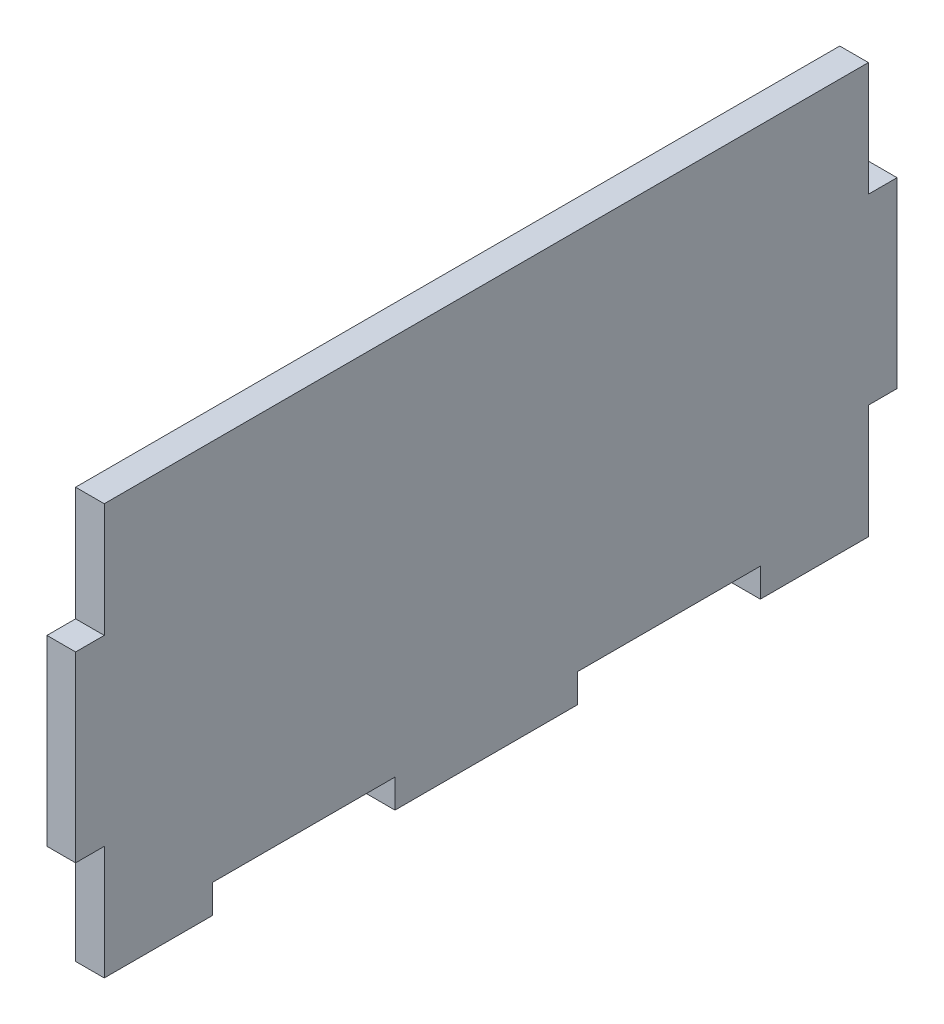
ISO-10303-21;
HEADER;
FILE_DESCRIPTION(('STEP AP214'),'2;1');
FILE_NAME('part.step','',(''),(''),'','','');
FILE_SCHEMA(('AUTOMOTIVE_DESIGN { 1 0 10303 214 1 1 1 1 }'));
ENDSEC;
DATA;
#1=APPLICATION_CONTEXT('core data for automotive mechanical design processes');
#2=APPLICATION_PROTOCOL_DEFINITION('international standard','automotive_design',2000,#1);
#3=PRODUCT_CONTEXT('',#1,'mechanical');
#4=PRODUCT('Part','Part','',(#3));
#5=PRODUCT_RELATED_PRODUCT_CATEGORY('part','',(#4));
#6=PRODUCT_DEFINITION_FORMATION('','',#4);
#7=PRODUCT_DEFINITION_CONTEXT('part definition',#1,'design');
#8=PRODUCT_DEFINITION('design','',#6,#7);
#9=PRODUCT_DEFINITION_SHAPE('','',#8);
#10=(LENGTH_UNIT() NAMED_UNIT(*) SI_UNIT(.MILLI.,.METRE.));
#11=(NAMED_UNIT(*) PLANE_ANGLE_UNIT() SI_UNIT($,.RADIAN.));
#12=(NAMED_UNIT(*) SI_UNIT($,.STERADIAN.) SOLID_ANGLE_UNIT());
#13=UNCERTAINTY_MEASURE_WITH_UNIT(LENGTH_MEASURE(1.E-05),#10,'distance_accuracy_value','');
#14=(GEOMETRIC_REPRESENTATION_CONTEXT(3) GLOBAL_UNCERTAINTY_ASSIGNED_CONTEXT((#13)) GLOBAL_UNIT_ASSIGNED_CONTEXT((#10,
#11,#12)) REPRESENTATION_CONTEXT('',''));
#15=CARTESIAN_POINT('',(0.,0.,0.));
#16=DIRECTION('',(0.,0.,1.));
#17=DIRECTION('',(1.,0.,0.));
#18=AXIS2_PLACEMENT_3D('',#15,#16,#17);
#19=CARTESIAN_POINT('',(3.,-27.22111753652,-97.3189618076706));
#20=DIRECTION('',(0.,-1.,0.));
#21=DIRECTION('',(0.,0.,-1.));
#22=AXIS2_PLACEMENT_3D('',#19,#20,#21);
#23=PLANE('',#22);
#24=DIRECTION('',(0.,0.,1.));
#25=VECTOR('',#24,1.);
#26=CARTESIAN_POINT('',(0.,-27.22111753652,-97.3189618076706));
#27=LINE('',#26,#25);
#28=CARTESIAN_POINT('',(0.,-27.22111753652,-97.3189618076706));
#29=VERTEX_POINT('',#28);
#30=CARTESIAN_POINT('',(0.,-27.22111753652,-17.3189618076706));
#31=VERTEX_POINT('',#30);
#32=EDGE_CURVE('E212',#29,#31,#27,.T.);
#33=ORIENTED_EDGE('',*,*,#32,.T.);
#34=DIRECTION('',(-1.,0.,0.));
#35=VECTOR('',#34,1.);
#36=CARTESIAN_POINT('',(3.,-27.22111753652,-17.3189618076706));
#37=LINE('',#36,#35);
#38=CARTESIAN_POINT('',(3.,-27.22111753652,-17.3189618076706));
#39=VERTEX_POINT('',#38);
#40=EDGE_CURVE('E11',#39,#31,#37,.T.);
#41=ORIENTED_EDGE('',*,*,#40,.F.);
#42=DIRECTION('',(0.,0.,1.));
#43=VECTOR('',#42,1.);
#44=CARTESIAN_POINT('',(3.,-27.22111753652,-97.3189618076706));
#45=LINE('',#44,#43);
#46=CARTESIAN_POINT('',(3.,-27.22111753652,-97.3189618076706));
#47=VERTEX_POINT('',#46);
#48=EDGE_CURVE('E270',#47,#39,#45,.T.);
#49=ORIENTED_EDGE('',*,*,#48,.F.);
#50=DIRECTION('',(-1.,0.,0.));
#51=VECTOR('',#50,1.);
#52=CARTESIAN_POINT('',(3.,-27.22111753652,-97.3189618076706));
#53=LINE('',#52,#51);
#54=EDGE_CURVE('E208',#47,#29,#53,.T.);
#55=ORIENTED_EDGE('',*,*,#54,.T.);
#56=EDGE_LOOP('',(#33,#41,#49,#55));
#57=FACE_BOUND('',#56,.T.);
#58=ADVANCED_FACE('F39',(#57),#23,.F.);
#59=CARTESIAN_POINT('',(3.,-27.22111753652,-17.3189618076706));
#60=DIRECTION('',(0.,0.,-1.));
#61=DIRECTION('',(-1.,0.,0.));
#62=AXIS2_PLACEMENT_3D('',#59,#60,#61);
#63=PLANE('',#62);
#64=DIRECTION('',(0.,-1.,0.));
#65=VECTOR('',#64,1.);
#66=CARTESIAN_POINT('',(0.,-27.22111753652,-17.3189618076706));
#67=LINE('',#66,#65);
#68=CARTESIAN_POINT('',(0.,-39.15861753652,-17.3189618076706));
#69=VERTEX_POINT('',#68);
#70=EDGE_CURVE('E216',#31,#69,#67,.T.);
#71=ORIENTED_EDGE('',*,*,#70,.T.);
#72=DIRECTION('',(-1.,0.,0.));
#73=VECTOR('',#72,1.);
#74=CARTESIAN_POINT('',(3.,-39.15861753652,-17.3189618076706));
#75=LINE('',#74,#73);
#76=CARTESIAN_POINT('',(3.,-39.15861753652,-17.3189618076706));
#77=VERTEX_POINT('',#76);
#78=EDGE_CURVE('E48',#77,#69,#75,.T.);
#79=ORIENTED_EDGE('',*,*,#78,.F.);
#80=DIRECTION('',(0.,-1.,0.));
#81=VECTOR('',#80,1.);
#82=CARTESIAN_POINT('',(3.,-27.22111753652,-17.3189618076706));
#83=LINE('',#82,#81);
#84=EDGE_CURVE('E135',#39,#77,#83,.T.);
#85=ORIENTED_EDGE('',*,*,#84,.F.);
#86=ORIENTED_EDGE('',*,*,#40,.T.);
#87=EDGE_LOOP('',(#71,#79,#85,#86));
#88=FACE_BOUND('',#87,.T.);
#89=ADVANCED_FACE('F420',(#88),#63,.F.);
#90=CARTESIAN_POINT('',(3.,-39.15861753652,-17.3189618076706));
#91=DIRECTION('',(0.,-1.,0.));
#92=DIRECTION('',(0.,0.,-1.));
#93=AXIS2_PLACEMENT_3D('',#90,#91,#92);
#94=PLANE('',#93);
#95=DIRECTION('',(0.,0.,1.));
#96=VECTOR('',#95,1.);
#97=CARTESIAN_POINT('',(0.,-39.15861753652,-17.3189618076706));
#98=LINE('',#97,#96);
#99=CARTESIAN_POINT('',(0.,-39.15861753652,-14.3189618076706));
#100=VERTEX_POINT('',#99);
#101=EDGE_CURVE('E219',#69,#100,#98,.T.);
#102=ORIENTED_EDGE('',*,*,#101,.T.);
#103=DIRECTION('',(-1.,0.,0.));
#104=VECTOR('',#103,1.);
#105=CARTESIAN_POINT('',(3.,-39.15861753652,-14.3189618076706));
#106=LINE('',#105,#104);
#107=CARTESIAN_POINT('',(3.,-39.15861753652,-14.3189618076706));
#108=VERTEX_POINT('',#107);
#109=EDGE_CURVE('E329',#108,#100,#106,.T.);
#110=ORIENTED_EDGE('',*,*,#109,.F.);
#111=DIRECTION('',(0.,0.,1.));
#112=VECTOR('',#111,1.);
#113=CARTESIAN_POINT('',(3.,-39.15861753652,-17.3189618076706));
#114=LINE('',#113,#112);
#115=EDGE_CURVE('E339',#77,#108,#114,.T.);
#116=ORIENTED_EDGE('',*,*,#115,.F.);
#117=ORIENTED_EDGE('',*,*,#78,.T.);
#118=EDGE_LOOP('',(#102,#110,#116,#117));
#119=FACE_BOUND('',#118,.T.);
#120=ADVANCED_FACE('F337',(#119),#94,.F.);
#121=CARTESIAN_POINT('',(3.,-39.15861753652,-14.3189618076706));
#122=DIRECTION('',(0.,0.,-1.));
#123=DIRECTION('',(-1.,0.,0.));
#124=AXIS2_PLACEMENT_3D('',#121,#122,#123);
#125=PLANE('',#124);
#126=DIRECTION('',(0.,-1.,0.));
#127=VECTOR('',#126,1.);
#128=CARTESIAN_POINT('',(0.,-39.15861753652,-14.3189618076706));
#129=LINE('',#128,#127);
#130=CARTESIAN_POINT('',(0.,-58.28361753652,-14.3189618076706));
#131=VERTEX_POINT('',#130);
#132=EDGE_CURVE('E222',#100,#131,#129,.T.);
#133=ORIENTED_EDGE('',*,*,#132,.T.);
#134=DIRECTION('',(-1.,0.,0.));
#135=VECTOR('',#134,1.);
#136=CARTESIAN_POINT('',(3.,-58.28361753652,-14.3189618076706));
#137=LINE('',#136,#135);
#138=CARTESIAN_POINT('',(3.,-58.28361753652,-14.3189618076706));
#139=VERTEX_POINT('',#138);
#140=EDGE_CURVE('E325',#139,#131,#137,.T.);
#141=ORIENTED_EDGE('',*,*,#140,.F.);
#142=DIRECTION('',(0.,-1.,0.));
#143=VECTOR('',#142,1.);
#144=CARTESIAN_POINT('',(3.,-39.15861753652,-14.3189618076706));
#145=LINE('',#144,#143);
#146=EDGE_CURVE('E358',#108,#139,#145,.T.);
#147=ORIENTED_EDGE('',*,*,#146,.F.);
#148=ORIENTED_EDGE('',*,*,#109,.T.);
#149=EDGE_LOOP('',(#133,#141,#147,#148));
#150=FACE_BOUND('',#149,.T.);
#151=ADVANCED_FACE('F348',(#150),#125,.F.);
#152=CARTESIAN_POINT('',(3.,-58.28361753652,-14.3189618076706));
#153=DIRECTION('',(0.,1.,0.));
#154=DIRECTION('',(0.,0.,1.));
#155=AXIS2_PLACEMENT_3D('',#152,#153,#154);
#156=PLANE('',#155);
#157=DIRECTION('',(0.,0.,-1.));
#158=VECTOR('',#157,1.);
#159=CARTESIAN_POINT('',(0.,-58.28361753652,-14.3189618076706));
#160=LINE('',#159,#158);
#161=CARTESIAN_POINT('',(0.,-58.28361753652,-17.3189618076706));
#162=VERTEX_POINT('',#161);
#163=EDGE_CURVE('E225',#131,#162,#160,.T.);
#164=ORIENTED_EDGE('',*,*,#163,.T.);
#165=DIRECTION('',(-1.,0.,0.));
#166=VECTOR('',#165,1.);
#167=CARTESIAN_POINT('',(3.,-58.28361753652,-17.3189618076706));
#168=LINE('',#167,#166);
#169=CARTESIAN_POINT('',(3.,-58.28361753652,-17.3189618076706));
#170=VERTEX_POINT('',#169);
#171=EDGE_CURVE('E321',#170,#162,#168,.T.);
#172=ORIENTED_EDGE('',*,*,#171,.F.);
#173=DIRECTION('',(0.,0.,-1.));
#174=VECTOR('',#173,1.);
#175=CARTESIAN_POINT('',(3.,-58.28361753652,-14.3189618076706));
#176=LINE('',#175,#174);
#177=EDGE_CURVE('E354',#139,#170,#176,.T.);
#178=ORIENTED_EDGE('',*,*,#177,.F.);
#179=ORIENTED_EDGE('',*,*,#140,.T.);
#180=EDGE_LOOP('',(#164,#172,#178,#179));
#181=FACE_BOUND('',#180,.T.);
#182=ADVANCED_FACE('F352',(#181),#156,.F.);
#183=CARTESIAN_POINT('',(3.,-58.28361753652,-17.3189618076706));
#184=DIRECTION('',(0.,0.,-1.));
#185=DIRECTION('',(-1.,0.,0.));
#186=AXIS2_PLACEMENT_3D('',#183,#184,#185);
#187=PLANE('',#186);
#188=DIRECTION('',(0.,-1.,0.));
#189=VECTOR('',#188,1.);
#190=CARTESIAN_POINT('',(0.,-58.28361753652,-17.3189618076706));
#191=LINE('',#190,#189);
#192=CARTESIAN_POINT('',(0.,-70.22111753652,-17.3189618076706));
#193=VERTEX_POINT('',#192);
#194=EDGE_CURVE('E228',#162,#193,#191,.T.);
#195=ORIENTED_EDGE('',*,*,#194,.T.);
#196=DIRECTION('',(-1.,0.,0.));
#197=VECTOR('',#196,1.);
#198=CARTESIAN_POINT('',(3.,-70.22111753652,-17.3189618076706));
#199=LINE('',#198,#197);
#200=CARTESIAN_POINT('',(3.,-70.22111753652,-17.3189618076706));
#201=VERTEX_POINT('',#200);
#202=EDGE_CURVE('E317',#201,#193,#199,.T.);
#203=ORIENTED_EDGE('',*,*,#202,.F.);
#204=DIRECTION('',(0.,-1.,0.));
#205=VECTOR('',#204,1.);
#206=CARTESIAN_POINT('',(3.,-58.28361753652,-17.3189618076706));
#207=LINE('',#206,#205);
#208=EDGE_CURVE('E357',#170,#201,#207,.T.);
#209=ORIENTED_EDGE('',*,*,#208,.F.);
#210=ORIENTED_EDGE('',*,*,#171,.T.);
#211=EDGE_LOOP('',(#195,#203,#209,#210));
#212=FACE_BOUND('',#211,.T.);
#213=ADVANCED_FACE('F433',(#212),#187,.F.);
#214=CARTESIAN_POINT('',(3.,-70.22111753652,-17.3189618076706));
#215=DIRECTION('',(0.,1.,0.));
#216=DIRECTION('',(0.,0.,1.));
#217=AXIS2_PLACEMENT_3D('',#214,#215,#216);
#218=PLANE('',#217);
#219=DIRECTION('',(0.,0.,-1.));
#220=VECTOR('',#219,1.);
#221=CARTESIAN_POINT('',(0.,-70.22111753652,-17.3189618076706));
#222=LINE('',#221,#220);
#223=CARTESIAN_POINT('',(0.,-70.22111753652,-28.6314618076706));
#224=VERTEX_POINT('',#223);
#225=EDGE_CURVE('E231',#193,#224,#222,.T.);
#226=ORIENTED_EDGE('',*,*,#225,.T.);
#227=DIRECTION('',(-1.,0.,0.));
#228=VECTOR('',#227,1.);
#229=CARTESIAN_POINT('',(3.,-70.22111753652,-28.6314618076706));
#230=LINE('',#229,#228);
#231=CARTESIAN_POINT('',(3.,-70.22111753652,-28.6314618076706));
#232=VERTEX_POINT('',#231);
#233=EDGE_CURVE('E313',#232,#224,#230,.T.);
#234=ORIENTED_EDGE('',*,*,#233,.F.);
#235=DIRECTION('',(0.,0.,-1.));
#236=VECTOR('',#235,1.);
#237=CARTESIAN_POINT('',(3.,-70.22111753652,-17.3189618076706));
#238=LINE('',#237,#236);
#239=EDGE_CURVE('E362',#201,#232,#238,.T.);
#240=ORIENTED_EDGE('',*,*,#239,.F.);
#241=ORIENTED_EDGE('',*,*,#202,.T.);
#242=EDGE_LOOP('',(#226,#234,#240,#241));
#243=FACE_BOUND('',#242,.T.);
#244=ADVANCED_FACE('F436',(#243),#218,.F.);
#245=CARTESIAN_POINT('',(3.,-70.22111753652,-28.6314618076706));
#246=DIRECTION('',(0.,0.,1.));
#247=DIRECTION('',(1.,0.,0.));
#248=AXIS2_PLACEMENT_3D('',#245,#246,#247);
#249=PLANE('',#248);
#250=DIRECTION('',(0.,1.,0.));
#251=VECTOR('',#250,1.);
#252=CARTESIAN_POINT('',(0.,-70.22111753652,-28.6314618076706));
#253=LINE('',#252,#251);
#254=CARTESIAN_POINT('',(0.,-67.22111753652,-28.6314618076706));
#255=VERTEX_POINT('',#254);
#256=EDGE_CURVE('E234',#224,#255,#253,.T.);
#257=ORIENTED_EDGE('',*,*,#256,.T.);
#258=DIRECTION('',(-1.,0.,0.));
#259=VECTOR('',#258,1.);
#260=CARTESIAN_POINT('',(3.,-67.22111753652,-28.6314618076706));
#261=LINE('',#260,#259);
#262=CARTESIAN_POINT('',(3.,-67.22111753652,-28.6314618076706));
#263=VERTEX_POINT('',#262);
#264=EDGE_CURVE('E309',#263,#255,#261,.T.);
#265=ORIENTED_EDGE('',*,*,#264,.F.);
#266=DIRECTION('',(0.,1.,0.));
#267=VECTOR('',#266,1.);
#268=CARTESIAN_POINT('',(3.,-70.22111753652,-28.6314618076706));
#269=LINE('',#268,#267);
#270=EDGE_CURVE('E369',#232,#263,#269,.T.);
#271=ORIENTED_EDGE('',*,*,#270,.F.);
#272=ORIENTED_EDGE('',*,*,#233,.T.);
#273=EDGE_LOOP('',(#257,#265,#271,#272));
#274=FACE_BOUND('',#273,.T.);
#275=ADVANCED_FACE('F440',(#274),#249,.F.);
#276=CARTESIAN_POINT('',(3.,-67.22111753652,-28.6314618076706));
#277=DIRECTION('',(0.,1.,0.));
#278=DIRECTION('',(0.,0.,1.));
#279=AXIS2_PLACEMENT_3D('',#276,#277,#278);
#280=PLANE('',#279);
#281=DIRECTION('',(0.,0.,-1.));
#282=VECTOR('',#281,1.);
#283=CARTESIAN_POINT('',(0.,-67.22111753652,-28.6314618076706));
#284=LINE('',#283,#282);
#285=CARTESIAN_POINT('',(0.,-67.22111753652,-47.7564618076706));
#286=VERTEX_POINT('',#285);
#287=EDGE_CURVE('E237',#255,#286,#284,.T.);
#288=ORIENTED_EDGE('',*,*,#287,.T.);
#289=DIRECTION('',(-1.,0.,0.));
#290=VECTOR('',#289,1.);
#291=CARTESIAN_POINT('',(3.,-67.22111753652,-47.7564618076706));
#292=LINE('',#291,#290);
#293=CARTESIAN_POINT('',(3.,-67.22111753652,-47.7564618076706));
#294=VERTEX_POINT('',#293);
#295=EDGE_CURVE('E305',#294,#286,#292,.T.);
#296=ORIENTED_EDGE('',*,*,#295,.F.);
#297=DIRECTION('',(0.,0.,-1.));
#298=VECTOR('',#297,1.);
#299=CARTESIAN_POINT('',(3.,-67.22111753652,-28.6314618076706));
#300=LINE('',#299,#298);
#301=EDGE_CURVE('E372',#263,#294,#300,.T.);
#302=ORIENTED_EDGE('',*,*,#301,.F.);
#303=ORIENTED_EDGE('',*,*,#264,.T.);
#304=EDGE_LOOP('',(#288,#296,#302,#303));
#305=FACE_BOUND('',#304,.T.);
#306=ADVANCED_FACE('F444',(#305),#280,.F.);
#307=CARTESIAN_POINT('',(3.,-67.22111753652,-47.7564618076706));
#308=DIRECTION('',(0.,0.,-1.));
#309=DIRECTION('',(-1.,0.,0.));
#310=AXIS2_PLACEMENT_3D('',#307,#308,#309);
#311=PLANE('',#310);
#312=DIRECTION('',(0.,-1.,0.));
#313=VECTOR('',#312,1.);
#314=CARTESIAN_POINT('',(0.,-67.22111753652,-47.7564618076706));
#315=LINE('',#314,#313);
#316=CARTESIAN_POINT('',(0.,-70.22111753652,-47.7564618076706));
#317=VERTEX_POINT('',#316);
#318=EDGE_CURVE('E240',#286,#317,#315,.T.);
#319=ORIENTED_EDGE('',*,*,#318,.T.);
#320=DIRECTION('',(-1.,0.,0.));
#321=VECTOR('',#320,1.);
#322=CARTESIAN_POINT('',(3.,-70.22111753652,-47.7564618076706));
#323=LINE('',#322,#321);
#324=CARTESIAN_POINT('',(3.,-70.22111753652,-47.7564618076706));
#325=VERTEX_POINT('',#324);
#326=EDGE_CURVE('E301',#325,#317,#323,.T.);
#327=ORIENTED_EDGE('',*,*,#326,.F.);
#328=DIRECTION('',(0.,-1.,0.));
#329=VECTOR('',#328,1.);
#330=CARTESIAN_POINT('',(3.,-67.22111753652,-47.7564618076706));
#331=LINE('',#330,#329);
#332=EDGE_CURVE('E375',#294,#325,#331,.T.);
#333=ORIENTED_EDGE('',*,*,#332,.F.);
#334=ORIENTED_EDGE('',*,*,#295,.T.);
#335=EDGE_LOOP('',(#319,#327,#333,#334));
#336=FACE_BOUND('',#335,.T.);
#337=ADVANCED_FACE('F448',(#336),#311,.F.);
#338=CARTESIAN_POINT('',(3.,-70.22111753652,-47.7564618076706));
#339=DIRECTION('',(0.,1.,0.));
#340=DIRECTION('',(0.,0.,1.));
#341=AXIS2_PLACEMENT_3D('',#338,#339,#340);
#342=PLANE('',#341);
#343=DIRECTION('',(0.,0.,-1.));
#344=VECTOR('',#343,1.);
#345=CARTESIAN_POINT('',(0.,-70.22111753652,-47.7564618076706));
#346=LINE('',#345,#344);
#347=CARTESIAN_POINT('',(0.,-70.22111753652,-66.8814618076706));
#348=VERTEX_POINT('',#347);
#349=EDGE_CURVE('E243',#317,#348,#346,.T.);
#350=ORIENTED_EDGE('',*,*,#349,.T.);
#351=DIRECTION('',(-1.,0.,0.));
#352=VECTOR('',#351,1.);
#353=CARTESIAN_POINT('',(3.,-70.22111753652,-66.8814618076706));
#354=LINE('',#353,#352);
#355=CARTESIAN_POINT('',(3.,-70.22111753652,-66.8814618076706));
#356=VERTEX_POINT('',#355);
#357=EDGE_CURVE('E297',#356,#348,#354,.T.);
#358=ORIENTED_EDGE('',*,*,#357,.F.);
#359=DIRECTION('',(0.,0.,-1.));
#360=VECTOR('',#359,1.);
#361=CARTESIAN_POINT('',(3.,-70.22111753652,-47.7564618076706));
#362=LINE('',#361,#360);
#363=EDGE_CURVE('E378',#325,#356,#362,.T.);
#364=ORIENTED_EDGE('',*,*,#363,.F.);
#365=ORIENTED_EDGE('',*,*,#326,.T.);
#366=EDGE_LOOP('',(#350,#358,#364,#365));
#367=FACE_BOUND('',#366,.T.);
#368=ADVANCED_FACE('F452',(#367),#342,.F.);
#369=CARTESIAN_POINT('',(3.,-70.22111753652,-66.8814618076706));
#370=DIRECTION('',(0.,0.,1.));
#371=DIRECTION('',(1.,0.,0.));
#372=AXIS2_PLACEMENT_3D('',#369,#370,#371);
#373=PLANE('',#372);
#374=DIRECTION('',(0.,1.,0.));
#375=VECTOR('',#374,1.);
#376=CARTESIAN_POINT('',(0.,-70.22111753652,-66.8814618076706));
#377=LINE('',#376,#375);
#378=CARTESIAN_POINT('',(0.,-67.22111753652,-66.8814618076706));
#379=VERTEX_POINT('',#378);
#380=EDGE_CURVE('E246',#348,#379,#377,.T.);
#381=ORIENTED_EDGE('',*,*,#380,.T.);
#382=DIRECTION('',(-1.,0.,0.));
#383=VECTOR('',#382,1.);
#384=CARTESIAN_POINT('',(3.,-67.22111753652,-66.8814618076706));
#385=LINE('',#384,#383);
#386=CARTESIAN_POINT('',(3.,-67.22111753652,-66.8814618076706));
#387=VERTEX_POINT('',#386);
#388=EDGE_CURVE('E293',#387,#379,#385,.T.);
#389=ORIENTED_EDGE('',*,*,#388,.F.);
#390=DIRECTION('',(0.,1.,0.));
#391=VECTOR('',#390,1.);
#392=CARTESIAN_POINT('',(3.,-70.22111753652,-66.8814618076706));
#393=LINE('',#392,#391);
#394=EDGE_CURVE('E381',#356,#387,#393,.T.);
#395=ORIENTED_EDGE('',*,*,#394,.F.);
#396=ORIENTED_EDGE('',*,*,#357,.T.);
#397=EDGE_LOOP('',(#381,#389,#395,#396));
#398=FACE_BOUND('',#397,.T.);
#399=ADVANCED_FACE('F456',(#398),#373,.F.);
#400=CARTESIAN_POINT('',(3.,-67.22111753652,-66.8814618076706));
#401=DIRECTION('',(0.,1.,0.));
#402=DIRECTION('',(0.,0.,1.));
#403=AXIS2_PLACEMENT_3D('',#400,#401,#402);
#404=PLANE('',#403);
#405=DIRECTION('',(0.,0.,-1.));
#406=VECTOR('',#405,1.);
#407=CARTESIAN_POINT('',(0.,-67.22111753652,-66.8814618076706));
#408=LINE('',#407,#406);
#409=CARTESIAN_POINT('',(0.,-67.22111753652,-86.0064618076706));
#410=VERTEX_POINT('',#409);
#411=EDGE_CURVE('E249',#379,#410,#408,.T.);
#412=ORIENTED_EDGE('',*,*,#411,.T.);
#413=DIRECTION('',(-1.,0.,0.));
#414=VECTOR('',#413,1.);
#415=CARTESIAN_POINT('',(3.,-67.22111753652,-86.0064618076706));
#416=LINE('',#415,#414);
#417=CARTESIAN_POINT('',(3.,-67.22111753652,-86.0064618076706));
#418=VERTEX_POINT('',#417);
#419=EDGE_CURVE('E289',#418,#410,#416,.T.);
#420=ORIENTED_EDGE('',*,*,#419,.F.);
#421=DIRECTION('',(0.,0.,-1.));
#422=VECTOR('',#421,1.);
#423=CARTESIAN_POINT('',(3.,-67.22111753652,-66.8814618076706));
#424=LINE('',#423,#422);
#425=EDGE_CURVE('E384',#387,#418,#424,.T.);
#426=ORIENTED_EDGE('',*,*,#425,.F.);
#427=ORIENTED_EDGE('',*,*,#388,.T.);
#428=EDGE_LOOP('',(#412,#420,#426,#427));
#429=FACE_BOUND('',#428,.T.);
#430=ADVANCED_FACE('F460',(#429),#404,.F.);
#431=CARTESIAN_POINT('',(3.,-67.22111753652,-86.0064618076706));
#432=DIRECTION('',(0.,0.,-1.));
#433=DIRECTION('',(-1.,0.,0.));
#434=AXIS2_PLACEMENT_3D('',#431,#432,#433);
#435=PLANE('',#434);
#436=DIRECTION('',(0.,-1.,0.));
#437=VECTOR('',#436,1.);
#438=CARTESIAN_POINT('',(0.,-67.22111753652,-86.0064618076706));
#439=LINE('',#438,#437);
#440=CARTESIAN_POINT('',(0.,-70.22111753652,-86.0064618076706));
#441=VERTEX_POINT('',#440);
#442=EDGE_CURVE('E252',#410,#441,#439,.T.);
#443=ORIENTED_EDGE('',*,*,#442,.T.);
#444=DIRECTION('',(-1.,0.,0.));
#445=VECTOR('',#444,1.);
#446=CARTESIAN_POINT('',(3.,-70.22111753652,-86.0064618076706));
#447=LINE('',#446,#445);
#448=CARTESIAN_POINT('',(3.,-70.22111753652,-86.0064618076706));
#449=VERTEX_POINT('',#448);
#450=EDGE_CURVE('E285',#449,#441,#447,.T.);
#451=ORIENTED_EDGE('',*,*,#450,.F.);
#452=DIRECTION('',(0.,-1.,0.));
#453=VECTOR('',#452,1.);
#454=CARTESIAN_POINT('',(3.,-67.22111753652,-86.0064618076706));
#455=LINE('',#454,#453);
#456=EDGE_CURVE('E387',#418,#449,#455,.T.);
#457=ORIENTED_EDGE('',*,*,#456,.F.);
#458=ORIENTED_EDGE('',*,*,#419,.T.);
#459=EDGE_LOOP('',(#443,#451,#457,#458));
#460=FACE_BOUND('',#459,.T.);
#461=ADVANCED_FACE('F464',(#460),#435,.F.);
#462=CARTESIAN_POINT('',(3.,-70.22111753652,-86.0064618076706));
#463=DIRECTION('',(0.,1.,0.));
#464=DIRECTION('',(0.,0.,1.));
#465=AXIS2_PLACEMENT_3D('',#462,#463,#464);
#466=PLANE('',#465);
#467=DIRECTION('',(0.,0.,-1.));
#468=VECTOR('',#467,1.);
#469=CARTESIAN_POINT('',(0.,-70.22111753652,-86.0064618076706));
#470=LINE('',#469,#468);
#471=CARTESIAN_POINT('',(0.,-70.22111753652,-97.3189618076706));
#472=VERTEX_POINT('',#471);
#473=EDGE_CURVE('E255',#441,#472,#470,.T.);
#474=ORIENTED_EDGE('',*,*,#473,.T.);
#475=DIRECTION('',(-1.,0.,0.));
#476=VECTOR('',#475,1.);
#477=CARTESIAN_POINT('',(3.,-70.22111753652,-97.3189618076706));
#478=LINE('',#477,#476);
#479=CARTESIAN_POINT('',(3.,-70.22111753652,-97.3189618076706));
#480=VERTEX_POINT('',#479);
#481=EDGE_CURVE('E281',#480,#472,#478,.T.);
#482=ORIENTED_EDGE('',*,*,#481,.F.);
#483=DIRECTION('',(0.,0.,-1.));
#484=VECTOR('',#483,1.);
#485=CARTESIAN_POINT('',(3.,-70.22111753652,-86.0064618076706));
#486=LINE('',#485,#484);
#487=EDGE_CURVE('E390',#449,#480,#486,.T.);
#488=ORIENTED_EDGE('',*,*,#487,.F.);
#489=ORIENTED_EDGE('',*,*,#450,.T.);
#490=EDGE_LOOP('',(#474,#482,#488,#489));
#491=FACE_BOUND('',#490,.T.);
#492=ADVANCED_FACE('F468',(#491),#466,.F.);
#493=CARTESIAN_POINT('',(3.,-70.22111753652,-97.3189618076706));
#494=DIRECTION('',(0.,0.,1.));
#495=DIRECTION('',(1.,0.,0.));
#496=AXIS2_PLACEMENT_3D('',#493,#494,#495);
#497=PLANE('',#496);
#498=DIRECTION('',(0.,1.,0.));
#499=VECTOR('',#498,1.);
#500=CARTESIAN_POINT('',(0.,-70.22111753652,-97.3189618076706));
#501=LINE('',#500,#499);
#502=CARTESIAN_POINT('',(0.,-58.28361753652,-97.3189618076706));
#503=VERTEX_POINT('',#502);
#504=EDGE_CURVE('E258',#472,#503,#501,.T.);
#505=ORIENTED_EDGE('',*,*,#504,.T.);
#506=DIRECTION('',(-1.,0.,0.));
#507=VECTOR('',#506,1.);
#508=CARTESIAN_POINT('',(3.,-58.28361753652,-97.3189618076706));
#509=LINE('',#508,#507);
#510=CARTESIAN_POINT('',(3.,-58.28361753652,-97.3189618076706));
#511=VERTEX_POINT('',#510);
#512=EDGE_CURVE('E277',#511,#503,#509,.T.);
#513=ORIENTED_EDGE('',*,*,#512,.F.);
#514=DIRECTION('',(0.,1.,0.));
#515=VECTOR('',#514,1.);
#516=CARTESIAN_POINT('',(3.,-70.22111753652,-97.3189618076706));
#517=LINE('',#516,#515);
#518=EDGE_CURVE('E393',#480,#511,#517,.T.);
#519=ORIENTED_EDGE('',*,*,#518,.F.);
#520=ORIENTED_EDGE('',*,*,#481,.T.);
#521=EDGE_LOOP('',(#505,#513,#519,#520));
#522=FACE_BOUND('',#521,.T.);
#523=ADVANCED_FACE('F401',(#522),#497,.F.);
#524=CARTESIAN_POINT('',(3.,-58.28361753652,-97.3189618076706));
#525=DIRECTION('',(0.,1.,0.));
#526=DIRECTION('',(0.,0.,1.));
#527=AXIS2_PLACEMENT_3D('',#524,#525,#526);
#528=PLANE('',#527);
#529=DIRECTION('',(0.,0.,-1.));
#530=VECTOR('',#529,1.);
#531=CARTESIAN_POINT('',(0.,-58.28361753652,-97.3189618076706));
#532=LINE('',#531,#530);
#533=CARTESIAN_POINT('',(0.,-58.28361753652,-100.318961807671));
#534=VERTEX_POINT('',#533);
#535=EDGE_CURVE('E261',#503,#534,#532,.T.);
#536=ORIENTED_EDGE('',*,*,#535,.T.);
#537=DIRECTION('',(-1.,0.,0.));
#538=VECTOR('',#537,1.);
#539=CARTESIAN_POINT('',(3.,-58.28361753652,-100.318961807671));
#540=LINE('',#539,#538);
#541=CARTESIAN_POINT('',(3.,-58.28361753652,-100.318961807671));
#542=VERTEX_POINT('',#541);
#543=EDGE_CURVE('E201',#542,#534,#540,.T.);
#544=ORIENTED_EDGE('',*,*,#543,.F.);
#545=DIRECTION('',(0.,0.,-1.));
#546=VECTOR('',#545,1.);
#547=CARTESIAN_POINT('',(3.,-58.28361753652,-97.3189618076706));
#548=LINE('',#547,#546);
#549=EDGE_CURVE('E190',#511,#542,#548,.T.);
#550=ORIENTED_EDGE('',*,*,#549,.F.);
#551=ORIENTED_EDGE('',*,*,#512,.T.);
#552=EDGE_LOOP('',(#536,#544,#550,#551));
#553=FACE_BOUND('',#552,.T.);
#554=ADVANCED_FACE('F405',(#553),#528,.F.);
#555=CARTESIAN_POINT('',(3.,-58.28361753652,-100.318961807671));
#556=DIRECTION('',(0.,0.,1.));
#557=DIRECTION('',(1.,0.,0.));
#558=AXIS2_PLACEMENT_3D('',#555,#556,#557);
#559=PLANE('',#558);
#560=DIRECTION('',(0.,1.,0.));
#561=VECTOR('',#560,1.);
#562=CARTESIAN_POINT('',(0.,-58.28361753652,-100.318961807671));
#563=LINE('',#562,#561);
#564=CARTESIAN_POINT('',(0.,-39.15861753652,-100.318961807671));
#565=VERTEX_POINT('',#564);
#566=EDGE_CURVE('E199',#534,#565,#563,.T.);
#567=ORIENTED_EDGE('',*,*,#566,.T.);
#568=DIRECTION('',(-1.,0.,0.));
#569=VECTOR('',#568,1.);
#570=CARTESIAN_POINT('',(3.,-39.15861753652,-100.318961807671));
#571=LINE('',#570,#569);
#572=CARTESIAN_POINT('',(3.,-39.15861753652,-100.318961807671));
#573=VERTEX_POINT('',#572);
#574=EDGE_CURVE('E196',#573,#565,#571,.T.);
#575=ORIENTED_EDGE('',*,*,#574,.F.);
#576=DIRECTION('',(0.,1.,0.));
#577=VECTOR('',#576,1.);
#578=CARTESIAN_POINT('',(3.,-58.28361753652,-100.318961807671));
#579=LINE('',#578,#577);
#580=EDGE_CURVE('E184',#542,#573,#579,.T.);
#581=ORIENTED_EDGE('',*,*,#580,.F.);
#582=ORIENTED_EDGE('',*,*,#543,.T.);
#583=EDGE_LOOP('',(#567,#575,#581,#582));
#584=FACE_BOUND('',#583,.T.);
#585=ADVANCED_FACE('F197',(#584),#559,.F.);
#586=CARTESIAN_POINT('',(3.,-39.15861753652,-100.318961807671));
#587=DIRECTION('',(0.,-1.,0.));
#588=DIRECTION('',(0.,0.,-1.));
#589=AXIS2_PLACEMENT_3D('',#586,#587,#588);
#590=PLANE('',#589);
#591=DIRECTION('',(0.,0.,1.));
#592=VECTOR('',#591,1.);
#593=CARTESIAN_POINT('',(0.,-39.15861753652,-100.318961807671));
#594=LINE('',#593,#592);
#595=CARTESIAN_POINT('',(0.,-39.15861753652,-97.3189618076706));
#596=VERTEX_POINT('',#595);
#597=EDGE_CURVE('E121',#565,#596,#594,.T.);
#598=ORIENTED_EDGE('',*,*,#597,.T.);
#599=DIRECTION('',(-1.,0.,0.));
#600=VECTOR('',#599,1.);
#601=CARTESIAN_POINT('',(3.,-39.15861753652,-97.3189618076706));
#602=LINE('',#601,#600);
#603=CARTESIAN_POINT('',(3.,-39.15861753652,-97.3189618076706));
#604=VERTEX_POINT('',#603);
#605=EDGE_CURVE('E202',#604,#596,#602,.T.);
#606=ORIENTED_EDGE('',*,*,#605,.F.);
#607=DIRECTION('',(0.,0.,1.));
#608=VECTOR('',#607,1.);
#609=CARTESIAN_POINT('',(3.,-39.15861753652,-100.318961807671));
#610=LINE('',#609,#608);
#611=EDGE_CURVE('E188',#573,#604,#610,.T.);
#612=ORIENTED_EDGE('',*,*,#611,.F.);
#613=ORIENTED_EDGE('',*,*,#574,.T.);
#614=EDGE_LOOP('',(#598,#606,#612,#613));
#615=FACE_BOUND('',#614,.T.);
#616=ADVANCED_FACE('F204',(#615),#590,.F.);
#617=CARTESIAN_POINT('',(3.,-39.15861753652,-97.3189618076706));
#618=DIRECTION('',(0.,0.,1.));
#619=DIRECTION('',(1.,0.,0.));
#620=AXIS2_PLACEMENT_3D('',#617,#618,#619);
#621=PLANE('',#620);
#622=DIRECTION('',(0.,1.,0.));
#623=VECTOR('',#622,1.);
#624=CARTESIAN_POINT('',(0.,-39.15861753652,-97.3189618076706));
#625=LINE('',#624,#623);
#626=EDGE_CURVE('E127',#596,#29,#625,.T.);
#627=ORIENTED_EDGE('',*,*,#626,.T.);
#628=ORIENTED_EDGE('',*,*,#54,.F.);
#629=DIRECTION('',(0.,1.,0.));
#630=VECTOR('',#629,1.);
#631=CARTESIAN_POINT('',(3.,-39.15861753652,-97.3189618076706));
#632=LINE('',#631,#630);
#633=EDGE_CURVE('E56',#604,#47,#632,.T.);
#634=ORIENTED_EDGE('',*,*,#633,.F.);
#635=ORIENTED_EDGE('',*,*,#605,.T.);
#636=EDGE_LOOP('',(#627,#628,#634,#635));
#637=FACE_BOUND('',#636,.T.);
#638=ADVANCED_FACE('F409',(#637),#621,.F.);
#639=CARTESIAN_POINT('',(3.,0.,0.));
#640=DIRECTION('',(1.,0.,0.));
#641=DIRECTION('',(0.,0.,-1.));
#642=AXIS2_PLACEMENT_3D('',#639,#640,#641);
#643=PLANE('',#642);
#644=ORIENTED_EDGE('',*,*,#48,.T.);
#645=ORIENTED_EDGE('',*,*,#84,.T.);
#646=ORIENTED_EDGE('',*,*,#115,.T.);
#647=ORIENTED_EDGE('',*,*,#146,.T.);
#648=ORIENTED_EDGE('',*,*,#177,.T.);
#649=ORIENTED_EDGE('',*,*,#208,.T.);
#650=ORIENTED_EDGE('',*,*,#239,.T.);
#651=ORIENTED_EDGE('',*,*,#270,.T.);
#652=ORIENTED_EDGE('',*,*,#301,.T.);
#653=ORIENTED_EDGE('',*,*,#332,.T.);
#654=ORIENTED_EDGE('',*,*,#363,.T.);
#655=ORIENTED_EDGE('',*,*,#394,.T.);
#656=ORIENTED_EDGE('',*,*,#425,.T.);
#657=ORIENTED_EDGE('',*,*,#456,.T.);
#658=ORIENTED_EDGE('',*,*,#487,.T.);
#659=ORIENTED_EDGE('',*,*,#518,.T.);
#660=ORIENTED_EDGE('',*,*,#549,.T.);
#661=ORIENTED_EDGE('',*,*,#580,.T.);
#662=ORIENTED_EDGE('',*,*,#611,.T.);
#663=ORIENTED_EDGE('',*,*,#633,.T.);
#664=EDGE_LOOP('',(#644,#645,#646,#647,#648,#649,#650,#651,#652,#653,#654,#655,#656,#657,#658,
#659,#660,#661,#662,#663));
#665=FACE_BOUND('',#664,.T.);
#666=ADVANCED_FACE('F186',(#665),#643,.T.);
#667=CARTESIAN_POINT('',(0.,0.,0.));
#668=DIRECTION('',(1.,0.,0.));
#669=DIRECTION('',(0.,0.,-1.));
#670=AXIS2_PLACEMENT_3D('',#667,#668,#669);
#671=PLANE('',#670);
#672=ORIENTED_EDGE('',*,*,#32,.F.);
#673=ORIENTED_EDGE('',*,*,#626,.F.);
#674=ORIENTED_EDGE('',*,*,#597,.F.);
#675=ORIENTED_EDGE('',*,*,#566,.F.);
#676=ORIENTED_EDGE('',*,*,#535,.F.);
#677=ORIENTED_EDGE('',*,*,#504,.F.);
#678=ORIENTED_EDGE('',*,*,#473,.F.);
#679=ORIENTED_EDGE('',*,*,#442,.F.);
#680=ORIENTED_EDGE('',*,*,#411,.F.);
#681=ORIENTED_EDGE('',*,*,#380,.F.);
#682=ORIENTED_EDGE('',*,*,#349,.F.);
#683=ORIENTED_EDGE('',*,*,#318,.F.);
#684=ORIENTED_EDGE('',*,*,#287,.F.);
#685=ORIENTED_EDGE('',*,*,#256,.F.);
#686=ORIENTED_EDGE('',*,*,#225,.F.);
#687=ORIENTED_EDGE('',*,*,#194,.F.);
#688=ORIENTED_EDGE('',*,*,#163,.F.);
#689=ORIENTED_EDGE('',*,*,#132,.F.);
#690=ORIENTED_EDGE('',*,*,#101,.F.);
#691=ORIENTED_EDGE('',*,*,#70,.F.);
#692=EDGE_LOOP('',(#672,#673,#674,#675,#676,#677,#678,#679,#680,#681,#682,#683,#684,#685,#686,
#687,#688,#689,#690,#691));
#693=FACE_BOUND('',#692,.T.);
#694=ADVANCED_FACE('F343',(#693),#671,.F.);
#695=CLOSED_SHELL('',(#58,#89,#120,#151,#182,#213,#244,#275,#306,#337,#368,#399,#430,#461,#492,
#523,#554,#585,#616,#638,#666,#694));
#696=MANIFOLD_SOLID_BREP('B2',#695);
#697=ADVANCED_BREP_SHAPE_REPRESENTATION('',(#18,#696),#14);
#698=SHAPE_DEFINITION_REPRESENTATION(#9,#697);
ENDSEC;
END-ISO-10303-21;
